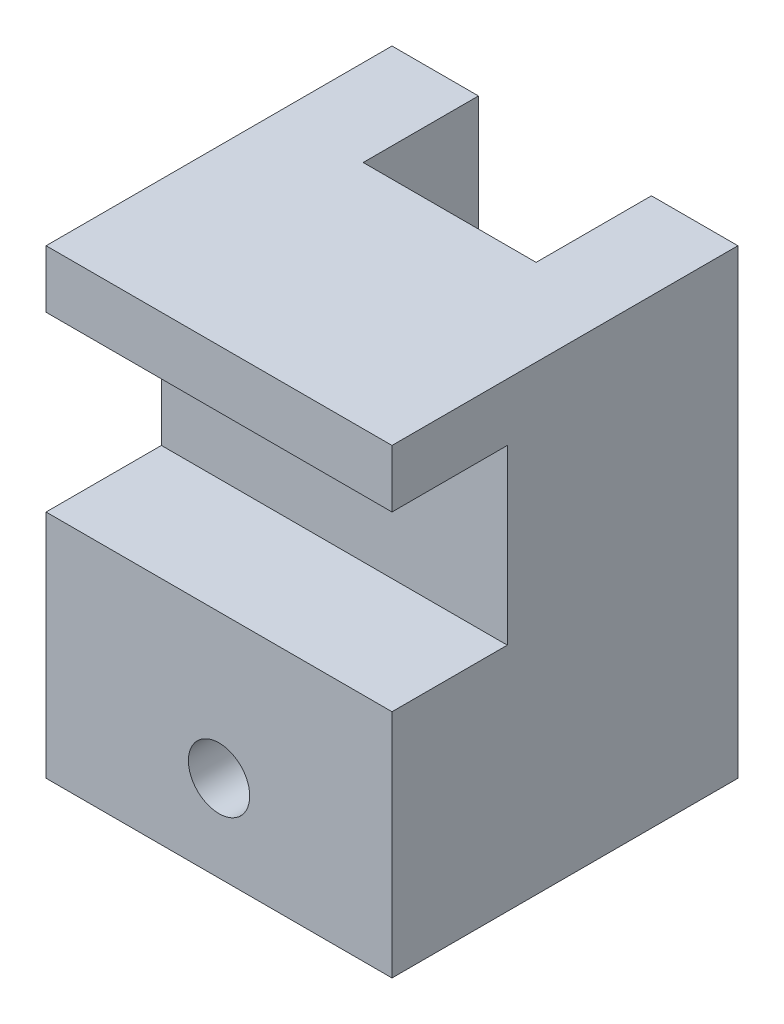
ISO-10303-21;
HEADER;
FILE_DESCRIPTION(('STEP AP214'),'2;1');
FILE_NAME('part.step','',(''),(''),'','','');
FILE_SCHEMA(('AUTOMOTIVE_DESIGN { 1 0 10303 214 1 1 1 1 }'));
ENDSEC;
DATA;
#1=APPLICATION_CONTEXT('core data for automotive mechanical design processes');
#2=APPLICATION_PROTOCOL_DEFINITION('international standard','automotive_design',2000,#1);
#3=PRODUCT_CONTEXT('',#1,'mechanical');
#4=PRODUCT('Part','Part','',(#3));
#5=PRODUCT_RELATED_PRODUCT_CATEGORY('part','',(#4));
#6=PRODUCT_DEFINITION_FORMATION('','',#4);
#7=PRODUCT_DEFINITION_CONTEXT('part definition',#1,'design');
#8=PRODUCT_DEFINITION('design','',#6,#7);
#9=PRODUCT_DEFINITION_SHAPE('','',#8);
#10=(LENGTH_UNIT() NAMED_UNIT(*) SI_UNIT(.MILLI.,.METRE.));
#11=(NAMED_UNIT(*) PLANE_ANGLE_UNIT() SI_UNIT($,.RADIAN.));
#12=(NAMED_UNIT(*) SI_UNIT($,.STERADIAN.) SOLID_ANGLE_UNIT());
#13=UNCERTAINTY_MEASURE_WITH_UNIT(LENGTH_MEASURE(1.E-05),#10,'distance_accuracy_value','');
#14=(GEOMETRIC_REPRESENTATION_CONTEXT(3) GLOBAL_UNCERTAINTY_ASSIGNED_CONTEXT((#13)) GLOBAL_UNIT_ASSIGNED_CONTEXT((#10,
#11,#12)) REPRESENTATION_CONTEXT('',''));
#15=CARTESIAN_POINT('',(0.,0.,0.));
#16=DIRECTION('',(0.,0.,1.));
#17=DIRECTION('',(1.,0.,0.));
#18=AXIS2_PLACEMENT_3D('',#15,#16,#17);
#19=CARTESIAN_POINT('',(0.,0.,19.05));
#20=DIRECTION('',(0.,0.,-1.));
#21=DIRECTION('',(-1.,0.,0.));
#22=AXIS2_PLACEMENT_3D('',#19,#20,#21);
#23=PLANE('',#22);
#24=CARTESIAN_POINT('',(0.,-15.875,19.05));
#25=DIRECTION('',(0.,0.,1.));
#26=DIRECTION('',(1.,0.,0.));
#27=AXIS2_PLACEMENT_3D('',#24,#25,#26);
#28=CIRCLE('',#27,3.37819999999999);
#29=CARTESIAN_POINT('',(3.37819999999999,-15.875,19.05));
#30=VERTEX_POINT('',#29);
#31=EDGE_CURVE('E142',#30,#30,#28,.T.);
#32=ORIENTED_EDGE('',*,*,#31,.F.);
#33=EDGE_LOOP('',(#32));
#34=FACE_BOUND('',#33,.T.);
#35=DIRECTION('',(0.,1.,0.));
#36=VECTOR('',#35,1.);
#37=CARTESIAN_POINT('',(19.05,-25.4,19.05));
#38=LINE('',#37,#36);
#39=CARTESIAN_POINT('',(19.05,-25.4,19.05));
#40=VERTEX_POINT('',#39);
#41=CARTESIAN_POINT('',(19.05,0.,19.05));
#42=VERTEX_POINT('',#41);
#43=EDGE_CURVE('E236',#40,#42,#38,.T.);
#44=ORIENTED_EDGE('',*,*,#43,.T.);
#45=DIRECTION('',(1.,0.,0.));
#46=VECTOR('',#45,1.);
#47=CARTESIAN_POINT('',(-19.05,0.,19.05));
#48=LINE('',#47,#46);
#49=CARTESIAN_POINT('',(-19.05,0.,19.05));
#50=VERTEX_POINT('',#49);
#51=EDGE_CURVE('E162',#50,#42,#48,.T.);
#52=ORIENTED_EDGE('',*,*,#51,.F.);
#53=DIRECTION('',(0.,1.,0.));
#54=VECTOR('',#53,1.);
#55=CARTESIAN_POINT('',(-19.05,-25.4,19.05));
#56=LINE('',#55,#54);
#57=CARTESIAN_POINT('',(-19.05,-25.4,19.05));
#58=VERTEX_POINT('',#57);
#59=EDGE_CURVE('E226',#58,#50,#56,.T.);
#60=ORIENTED_EDGE('',*,*,#59,.F.);
#61=DIRECTION('',(1.,0.,0.));
#62=VECTOR('',#61,1.);
#63=CARTESIAN_POINT('',(-19.05,-25.4,19.05));
#64=LINE('',#63,#62);
#65=EDGE_CURVE('E240',#58,#40,#64,.T.);
#66=ORIENTED_EDGE('',*,*,#65,.T.);
#67=EDGE_LOOP('',(#44,#52,#60,#66));
#68=FACE_BOUND('',#67,.T.);
#69=ADVANCED_FACE('F39',(#34,#68),#23,.F.);
#70=CARTESIAN_POINT('',(0.,0.,-19.05));
#71=DIRECTION('',(0.,0.,-1.));
#72=DIRECTION('',(-1.,0.,0.));
#73=AXIS2_PLACEMENT_3D('',#70,#71,#72);
#74=PLANE('',#73);
#75=DIRECTION('',(0.,1.,0.));
#76=VECTOR('',#75,1.);
#77=CARTESIAN_POINT('',(-9.525,-25.4,-19.05));
#78=LINE('',#77,#76);
#79=CARTESIAN_POINT('',(-9.525,-25.4,-19.05));
#80=VERTEX_POINT('',#79);
#81=CARTESIAN_POINT('',(-9.525,25.4,-19.05));
#82=VERTEX_POINT('',#81);
#83=EDGE_CURVE('E181',#80,#82,#78,.T.);
#84=ORIENTED_EDGE('',*,*,#83,.F.);
#85=DIRECTION('',(1.,0.,0.));
#86=VECTOR('',#85,1.);
#87=CARTESIAN_POINT('',(-19.05,-25.4,-19.05));
#88=LINE('',#87,#86);
#89=CARTESIAN_POINT('',(-19.05,-25.4,-19.05));
#90=VERTEX_POINT('',#89);
#91=EDGE_CURVE('E256',#90,#80,#88,.T.);
#92=ORIENTED_EDGE('',*,*,#91,.F.);
#93=DIRECTION('',(0.,1.,0.));
#94=VECTOR('',#93,1.);
#95=CARTESIAN_POINT('',(-19.05,-25.4,-19.05));
#96=LINE('',#95,#94);
#97=CARTESIAN_POINT('',(-19.05,25.4,-19.05));
#98=VERTEX_POINT('',#97);
#99=EDGE_CURVE('E216',#90,#98,#96,.T.);
#100=ORIENTED_EDGE('',*,*,#99,.T.);
#101=DIRECTION('',(1.,0.,0.));
#102=VECTOR('',#101,1.);
#103=CARTESIAN_POINT('',(-19.05,25.4,-19.05));
#104=LINE('',#103,#102);
#105=EDGE_CURVE('E247',#98,#82,#104,.T.);
#106=ORIENTED_EDGE('',*,*,#105,.T.);
#107=EDGE_LOOP('',(#84,#92,#100,#106));
#108=FACE_BOUND('',#107,.T.);
#109=ADVANCED_FACE('F281',(#108),#74,.T.);
#110=CARTESIAN_POINT('',(-19.05,-25.4,19.05));
#111=DIRECTION('',(-1.,0.,0.));
#112=DIRECTION('',(0.,0.,1.));
#113=AXIS2_PLACEMENT_3D('',#110,#111,#112);
#114=PLANE('',#113);
#115=DIRECTION('',(0.,0.,1.));
#116=VECTOR('',#115,1.);
#117=CARTESIAN_POINT('',(-19.05,0.,6.35));
#118=LINE('',#117,#116);
#119=CARTESIAN_POINT('',(-19.05,0.,6.35));
#120=VERTEX_POINT('',#119);
#121=EDGE_CURVE('E182',#120,#50,#118,.T.);
#122=ORIENTED_EDGE('',*,*,#121,.F.);
#123=DIRECTION('',(0.,-1.,0.));
#124=VECTOR('',#123,1.);
#125=CARTESIAN_POINT('',(-19.05,0.,6.35));
#126=LINE('',#125,#124);
#127=CARTESIAN_POINT('',(-19.05,19.05,6.35));
#128=VERTEX_POINT('',#127);
#129=EDGE_CURVE('E166',#128,#120,#126,.T.);
#130=ORIENTED_EDGE('',*,*,#129,.F.);
#131=DIRECTION('',(0.,0.,1.));
#132=VECTOR('',#131,1.);
#133=CARTESIAN_POINT('',(-19.05,19.05,6.35));
#134=LINE('',#133,#132);
#135=CARTESIAN_POINT('',(-19.05,19.05,19.05));
#136=VERTEX_POINT('',#135);
#137=EDGE_CURVE('E185',#128,#136,#134,.T.);
#138=ORIENTED_EDGE('',*,*,#137,.T.);
#139=CARTESIAN_POINT('',(-19.05,25.4,19.05));
#140=VERTEX_POINT('',#139);
#141=EDGE_CURVE('E231',#136,#140,#56,.T.);
#142=ORIENTED_EDGE('',*,*,#141,.T.);
#143=DIRECTION('',(0.,0.,-1.));
#144=VECTOR('',#143,1.);
#145=CARTESIAN_POINT('',(-19.05,25.4,19.05));
#146=LINE('',#145,#144);
#147=EDGE_CURVE('E43',#140,#98,#146,.T.);
#148=ORIENTED_EDGE('',*,*,#147,.T.);
#149=ORIENTED_EDGE('',*,*,#99,.F.);
#150=DIRECTION('',(0.,0.,-1.));
#151=VECTOR('',#150,1.);
#152=CARTESIAN_POINT('',(-19.05,-25.4,19.05));
#153=LINE('',#152,#151);
#154=EDGE_CURVE('E11',#58,#90,#153,.T.);
#155=ORIENTED_EDGE('',*,*,#154,.F.);
#156=ORIENTED_EDGE('',*,*,#59,.T.);
#157=EDGE_LOOP('',(#122,#130,#138,#142,#148,#149,#155,#156));
#158=FACE_BOUND('',#157,.T.);
#159=ADVANCED_FACE('F41',(#158),#114,.T.);
#160=CARTESIAN_POINT('',(-19.05,-25.4,19.05));
#161=DIRECTION('',(0.,1.,0.));
#162=DIRECTION('',(0.,0.,1.));
#163=AXIS2_PLACEMENT_3D('',#160,#161,#162);
#164=PLANE('',#163);
#165=ORIENTED_EDGE('',*,*,#91,.T.);
#166=DIRECTION('',(0.,0.,-1.));
#167=VECTOR('',#166,1.);
#168=CARTESIAN_POINT('',(-9.525,-25.4,-6.35));
#169=LINE('',#168,#167);
#170=CARTESIAN_POINT('',(-9.525,-25.4,-6.35));
#171=VERTEX_POINT('',#170);
#172=EDGE_CURVE('E213',#171,#80,#169,.T.);
#173=ORIENTED_EDGE('',*,*,#172,.F.);
#174=DIRECTION('',(-1.,0.,0.));
#175=VECTOR('',#174,1.);
#176=CARTESIAN_POINT('',(9.525,-25.4,-6.35));
#177=LINE('',#176,#175);
#178=CARTESIAN_POINT('',(9.525,-25.4,-6.35));
#179=VERTEX_POINT('',#178);
#180=EDGE_CURVE('E204',#179,#171,#177,.T.);
#181=ORIENTED_EDGE('',*,*,#180,.F.);
#182=DIRECTION('',(0.,0.,-1.));
#183=VECTOR('',#182,1.);
#184=CARTESIAN_POINT('',(9.525,-25.4,-6.35));
#185=LINE('',#184,#183);
#186=CARTESIAN_POINT('',(9.525,-25.4,-19.05));
#187=VERTEX_POINT('',#186);
#188=EDGE_CURVE('E217',#179,#187,#185,.T.);
#189=ORIENTED_EDGE('',*,*,#188,.T.);
#190=CARTESIAN_POINT('',(19.05,-25.4,-19.05));
#191=VERTEX_POINT('',#190);
#192=EDGE_CURVE('E255',#187,#191,#88,.T.);
#193=ORIENTED_EDGE('',*,*,#192,.T.);
#194=DIRECTION('',(0.,0.,-1.));
#195=VECTOR('',#194,1.);
#196=CARTESIAN_POINT('',(19.05,-25.4,19.05));
#197=LINE('',#196,#195);
#198=EDGE_CURVE('E49',#40,#191,#197,.T.);
#199=ORIENTED_EDGE('',*,*,#198,.F.);
#200=ORIENTED_EDGE('',*,*,#65,.F.);
#201=ORIENTED_EDGE('',*,*,#154,.T.);
#202=EDGE_LOOP('',(#165,#173,#181,#189,#193,#199,#200,#201));
#203=FACE_BOUND('',#202,.T.);
#204=ADVANCED_FACE('F284',(#203),#164,.F.);
#205=CARTESIAN_POINT('',(19.05,-25.4,19.05));
#206=DIRECTION('',(-1.,0.,0.));
#207=DIRECTION('',(0.,0.,1.));
#208=AXIS2_PLACEMENT_3D('',#205,#206,#207);
#209=PLANE('',#208);
#210=DIRECTION('',(0.,1.,0.));
#211=VECTOR('',#210,1.);
#212=CARTESIAN_POINT('',(19.05,0.,6.35));
#213=LINE('',#212,#211);
#214=CARTESIAN_POINT('',(19.05,0.,6.35));
#215=VERTEX_POINT('',#214);
#216=CARTESIAN_POINT('',(19.05,19.05,6.35));
#217=VERTEX_POINT('',#216);
#218=EDGE_CURVE('E157',#215,#217,#213,.T.);
#219=ORIENTED_EDGE('',*,*,#218,.F.);
#220=DIRECTION('',(0.,0.,1.));
#221=VECTOR('',#220,1.);
#222=CARTESIAN_POINT('',(19.05,0.,6.35));
#223=LINE('',#222,#221);
#224=EDGE_CURVE('E177',#215,#42,#223,.T.);
#225=ORIENTED_EDGE('',*,*,#224,.T.);
#226=ORIENTED_EDGE('',*,*,#43,.F.);
#227=ORIENTED_EDGE('',*,*,#198,.T.);
#228=DIRECTION('',(0.,1.,0.));
#229=VECTOR('',#228,1.);
#230=CARTESIAN_POINT('',(19.05,-25.4,-19.05));
#231=LINE('',#230,#229);
#232=CARTESIAN_POINT('',(19.05,25.4,-19.05));
#233=VERTEX_POINT('',#232);
#234=EDGE_CURVE('E251',#191,#233,#231,.T.);
#235=ORIENTED_EDGE('',*,*,#234,.T.);
#236=DIRECTION('',(0.,0.,-1.));
#237=VECTOR('',#236,1.);
#238=CARTESIAN_POINT('',(19.05,25.4,19.05));
#239=LINE('',#238,#237);
#240=CARTESIAN_POINT('',(19.05,25.4,19.05));
#241=VERTEX_POINT('',#240);
#242=EDGE_CURVE('E262',#241,#233,#239,.T.);
#243=ORIENTED_EDGE('',*,*,#242,.F.);
#244=CARTESIAN_POINT('',(19.05,19.05,19.05));
#245=VERTEX_POINT('',#244);
#246=EDGE_CURVE('E235',#245,#241,#38,.T.);
#247=ORIENTED_EDGE('',*,*,#246,.F.);
#248=DIRECTION('',(0.,0.,1.));
#249=VECTOR('',#248,1.);
#250=CARTESIAN_POINT('',(19.05,19.05,6.35));
#251=LINE('',#250,#249);
#252=EDGE_CURVE('E57',#217,#245,#251,.T.);
#253=ORIENTED_EDGE('',*,*,#252,.F.);
#254=EDGE_LOOP('',(#219,#225,#226,#227,#235,#243,#247,#253));
#255=FACE_BOUND('',#254,.T.);
#256=ADVANCED_FACE('F298',(#255),#209,.F.);
#257=CARTESIAN_POINT('',(-19.05,25.4,19.05));
#258=DIRECTION('',(0.,1.,0.));
#259=DIRECTION('',(0.,0.,1.));
#260=AXIS2_PLACEMENT_3D('',#257,#258,#259);
#261=PLANE('',#260);
#262=DIRECTION('',(0.,0.,-1.));
#263=VECTOR('',#262,1.);
#264=CARTESIAN_POINT('',(-9.525,25.4,-6.35));
#265=LINE('',#264,#263);
#266=CARTESIAN_POINT('',(-9.525,25.4,-6.35));
#267=VERTEX_POINT('',#266);
#268=EDGE_CURVE('E208',#267,#82,#265,.T.);
#269=ORIENTED_EDGE('',*,*,#268,.T.);
#270=ORIENTED_EDGE('',*,*,#105,.F.);
#271=ORIENTED_EDGE('',*,*,#147,.F.);
#272=DIRECTION('',(1.,0.,0.));
#273=VECTOR('',#272,1.);
#274=CARTESIAN_POINT('',(-19.05,25.4,19.05));
#275=LINE('',#274,#273);
#276=EDGE_CURVE('E230',#140,#241,#275,.T.);
#277=ORIENTED_EDGE('',*,*,#276,.T.);
#278=ORIENTED_EDGE('',*,*,#242,.T.);
#279=CARTESIAN_POINT('',(9.52499999999999,25.4,-19.05));
#280=VERTEX_POINT('',#279);
#281=EDGE_CURVE('E246',#280,#233,#104,.T.);
#282=ORIENTED_EDGE('',*,*,#281,.F.);
#283=DIRECTION('',(0.,0.,-1.));
#284=VECTOR('',#283,1.);
#285=CARTESIAN_POINT('',(9.525,25.4,-6.35));
#286=LINE('',#285,#284);
#287=CARTESIAN_POINT('',(9.525,25.4,-6.35));
#288=VERTEX_POINT('',#287);
#289=EDGE_CURVE('E65',#288,#280,#286,.T.);
#290=ORIENTED_EDGE('',*,*,#289,.F.);
#291=DIRECTION('',(1.,0.,0.));
#292=VECTOR('',#291,1.);
#293=CARTESIAN_POINT('',(9.525,25.4,-6.35));
#294=LINE('',#293,#292);
#295=EDGE_CURVE('E195',#267,#288,#294,.T.);
#296=ORIENTED_EDGE('',*,*,#295,.F.);
#297=EDGE_LOOP('',(#269,#270,#271,#277,#278,#282,#290,#296));
#298=FACE_BOUND('',#297,.T.);
#299=ADVANCED_FACE('F276',(#298),#261,.T.);
#300=ORIENTED_EDGE('',*,*,#141,.F.);
#301=DIRECTION('',(-1.,0.,0.));
#302=VECTOR('',#301,1.);
#303=CARTESIAN_POINT('',(-19.05,19.05,19.05));
#304=LINE('',#303,#302);
#305=EDGE_CURVE('E156',#245,#136,#304,.T.);
#306=ORIENTED_EDGE('',*,*,#305,.F.);
#307=ORIENTED_EDGE('',*,*,#246,.T.);
#308=ORIENTED_EDGE('',*,*,#276,.F.);
#309=EDGE_LOOP('',(#300,#306,#307,#308));
#310=FACE_BOUND('',#309,.T.);
#311=ADVANCED_FACE('F303',(#310),#23,.F.);
#312=DIRECTION('',(0.,-1.,0.));
#313=VECTOR('',#312,1.);
#314=CARTESIAN_POINT('',(9.525,-25.4,-19.05));
#315=LINE('',#314,#313);
#316=EDGE_CURVE('E196',#280,#187,#315,.T.);
#317=ORIENTED_EDGE('',*,*,#316,.F.);
#318=ORIENTED_EDGE('',*,*,#281,.T.);
#319=ORIENTED_EDGE('',*,*,#234,.F.);
#320=ORIENTED_EDGE('',*,*,#192,.F.);
#321=EDGE_LOOP('',(#317,#318,#319,#320));
#322=FACE_BOUND('',#321,.T.);
#323=ADVANCED_FACE('F309',(#322),#74,.T.);
#324=CARTESIAN_POINT('',(-9.525,-25.4,-6.35));
#325=DIRECTION('',(-1.,0.,0.));
#326=DIRECTION('',(0.,0.,1.));
#327=AXIS2_PLACEMENT_3D('',#324,#325,#326);
#328=PLANE('',#327);
#329=ORIENTED_EDGE('',*,*,#83,.T.);
#330=ORIENTED_EDGE('',*,*,#268,.F.);
#331=DIRECTION('',(0.,1.,0.));
#332=VECTOR('',#331,1.);
#333=CARTESIAN_POINT('',(-9.525,-25.4,-6.35));
#334=LINE('',#333,#332);
#335=EDGE_CURVE('E191',#171,#267,#334,.T.);
#336=ORIENTED_EDGE('',*,*,#335,.F.);
#337=ORIENTED_EDGE('',*,*,#172,.T.);
#338=EDGE_LOOP('',(#329,#330,#336,#337));
#339=FACE_BOUND('',#338,.T.);
#340=ADVANCED_FACE('F314',(#339),#328,.F.);
#341=CARTESIAN_POINT('',(9.525,-25.4,-6.35));
#342=DIRECTION('',(1.,0.,0.));
#343=DIRECTION('',(0.,0.,-1.));
#344=AXIS2_PLACEMENT_3D('',#341,#342,#343);
#345=PLANE('',#344);
#346=ORIENTED_EDGE('',*,*,#316,.T.);
#347=ORIENTED_EDGE('',*,*,#188,.F.);
#348=DIRECTION('',(0.,-1.,0.));
#349=VECTOR('',#348,1.);
#350=CARTESIAN_POINT('',(9.525,-25.4,-6.35));
#351=LINE('',#350,#349);
#352=EDGE_CURVE('E200',#288,#179,#351,.T.);
#353=ORIENTED_EDGE('',*,*,#352,.F.);
#354=ORIENTED_EDGE('',*,*,#289,.T.);
#355=EDGE_LOOP('',(#346,#347,#353,#354));
#356=FACE_BOUND('',#355,.T.);
#357=ADVANCED_FACE('F316',(#356),#345,.F.);
#358=CARTESIAN_POINT('',(0.,0.,-6.35));
#359=DIRECTION('',(0.,0.,1.));
#360=DIRECTION('',(1.,0.,0.));
#361=AXIS2_PLACEMENT_3D('',#358,#359,#360);
#362=PLANE('',#361);
#363=CARTESIAN_POINT('',(0.,-15.875,-6.35));
#364=DIRECTION('',(0.,0.,1.));
#365=DIRECTION('',(1.,0.,0.));
#366=AXIS2_PLACEMENT_3D('',#363,#364,#365);
#367=CIRCLE('',#366,3.37819999999999);
#368=CARTESIAN_POINT('',(3.37819999999999,-15.875,-6.35));
#369=VERTEX_POINT('',#368);
#370=EDGE_CURVE('E148',#369,#369,#367,.T.);
#371=ORIENTED_EDGE('',*,*,#370,.T.);
#372=EDGE_LOOP('',(#371));
#373=FACE_BOUND('',#372,.T.);
#374=ORIENTED_EDGE('',*,*,#335,.T.);
#375=ORIENTED_EDGE('',*,*,#295,.T.);
#376=ORIENTED_EDGE('',*,*,#352,.T.);
#377=ORIENTED_EDGE('',*,*,#180,.T.);
#378=EDGE_LOOP('',(#374,#375,#376,#377));
#379=FACE_BOUND('',#378,.T.);
#380=ADVANCED_FACE('F312',(#373,#379),#362,.F.);
#381=CARTESIAN_POINT('',(-19.05,0.,6.35));
#382=DIRECTION('',(0.,-1.,0.));
#383=DIRECTION('',(0.,0.,-1.));
#384=AXIS2_PLACEMENT_3D('',#381,#382,#383);
#385=PLANE('',#384);
#386=ORIENTED_EDGE('',*,*,#51,.T.);
#387=ORIENTED_EDGE('',*,*,#224,.F.);
#388=DIRECTION('',(1.,0.,0.));
#389=VECTOR('',#388,1.);
#390=CARTESIAN_POINT('',(-19.05,0.,6.35));
#391=LINE('',#390,#389);
#392=EDGE_CURVE('E169',#120,#215,#391,.T.);
#393=ORIENTED_EDGE('',*,*,#392,.F.);
#394=ORIENTED_EDGE('',*,*,#121,.T.);
#395=EDGE_LOOP('',(#386,#387,#393,#394));
#396=FACE_BOUND('',#395,.T.);
#397=ADVANCED_FACE('F294',(#396),#385,.F.);
#398=CARTESIAN_POINT('',(-19.05,19.05,6.35));
#399=DIRECTION('',(0.,1.,0.));
#400=DIRECTION('',(0.,0.,1.));
#401=AXIS2_PLACEMENT_3D('',#398,#399,#400);
#402=PLANE('',#401);
#403=ORIENTED_EDGE('',*,*,#305,.T.);
#404=ORIENTED_EDGE('',*,*,#137,.F.);
#405=DIRECTION('',(-1.,0.,0.));
#406=VECTOR('',#405,1.);
#407=CARTESIAN_POINT('',(-19.05,19.05,6.35));
#408=LINE('',#407,#406);
#409=EDGE_CURVE('E161',#217,#128,#408,.T.);
#410=ORIENTED_EDGE('',*,*,#409,.F.);
#411=ORIENTED_EDGE('',*,*,#252,.T.);
#412=EDGE_LOOP('',(#403,#404,#410,#411));
#413=FACE_BOUND('',#412,.T.);
#414=ADVANCED_FACE('F393',(#413),#402,.F.);
#415=CARTESIAN_POINT('',(0.,0.,6.35));
#416=DIRECTION('',(0.,0.,-1.));
#417=DIRECTION('',(-1.,0.,0.));
#418=AXIS2_PLACEMENT_3D('',#415,#416,#417);
#419=PLANE('',#418);
#420=CARTESIAN_POINT('',(0.,9.525,6.35));
#421=DIRECTION('',(0.,0.,1.));
#422=DIRECTION('',(1.,0.,0.));
#423=AXIS2_PLACEMENT_3D('',#420,#421,#422);
#424=CIRCLE('',#423,1.72719999999999);
#425=CARTESIAN_POINT('',(1.72719999999999,9.525,6.35));
#426=VERTEX_POINT('',#425);
#427=EDGE_CURVE('E143',#426,#426,#424,.T.);
#428=ORIENTED_EDGE('',*,*,#427,.F.);
#429=EDGE_LOOP('',(#428));
#430=FACE_BOUND('',#429,.T.);
#431=ORIENTED_EDGE('',*,*,#218,.T.);
#432=ORIENTED_EDGE('',*,*,#409,.T.);
#433=ORIENTED_EDGE('',*,*,#129,.T.);
#434=ORIENTED_EDGE('',*,*,#392,.T.);
#435=EDGE_LOOP('',(#431,#432,#433,#434));
#436=FACE_BOUND('',#435,.T.);
#437=ADVANCED_FACE('F301',(#430,#436),#419,.F.);
#438=CARTESIAN_POINT('',(0.,-15.875,19.05));
#439=DIRECTION('',(0.,0.,1.));
#440=DIRECTION('',(1.,0.,0.));
#441=AXIS2_PLACEMENT_3D('',#438,#439,#440);
#442=CYLINDRICAL_SURFACE('',#441,3.37819999999999);
#443=ORIENTED_EDGE('',*,*,#31,.T.);
#444=EDGE_LOOP('',(#443));
#445=FACE_BOUND('',#444,.T.);
#446=ORIENTED_EDGE('',*,*,#370,.F.);
#447=EDGE_LOOP('',(#446));
#448=FACE_BOUND('',#447,.T.);
#449=ADVANCED_FACE('F135',(#445,#448),#442,.F.);
#450=CARTESIAN_POINT('',(0.,9.525,-4.318));
#451=DIRECTION('',(0.,0.,1.));
#452=DIRECTION('',(1.,0.,0.));
#453=AXIS2_PLACEMENT_3D('',#450,#451,#452);
#454=CONICAL_SURFACE('',#453,1.72719999999999,1.02974425867665);
#455=CARTESIAN_POINT('',(0.,9.525,-5.35580646118439));
#456=VERTEX_POINT('',#455);
#457=VERTEX_LOOP('',#456);
#458=FACE_BOUND('',#457,.T.);
#459=CARTESIAN_POINT('',(0.,9.525,-4.318));
#460=DIRECTION('',(0.,0.,1.));
#461=DIRECTION('',(1.,0.,0.));
#462=AXIS2_PLACEMENT_3D('',#459,#460,#461);
#463=CIRCLE('',#462,1.72719999999999);
#464=CARTESIAN_POINT('',(1.72719999999999,9.525,-4.318));
#465=VERTEX_POINT('',#464);
#466=EDGE_CURVE('E139',#465,#465,#463,.T.);
#467=ORIENTED_EDGE('',*,*,#466,.T.);
#468=EDGE_LOOP('',(#467));
#469=FACE_BOUND('',#468,.T.);
#470=ADVANCED_FACE('F131',(#458,#469),#454,.F.);
#471=CARTESIAN_POINT('',(0.,9.525,6.35));
#472=DIRECTION('',(0.,0.,1.));
#473=DIRECTION('',(1.,0.,0.));
#474=AXIS2_PLACEMENT_3D('',#471,#472,#473);
#475=CYLINDRICAL_SURFACE('',#474,1.72719999999999);
#476=ORIENTED_EDGE('',*,*,#466,.F.);
#477=EDGE_LOOP('',(#476));
#478=FACE_BOUND('',#477,.T.);
#479=ORIENTED_EDGE('',*,*,#427,.T.);
#480=EDGE_LOOP('',(#479));
#481=FACE_BOUND('',#480,.T.);
#482=ADVANCED_FACE('F134',(#478,#481),#475,.F.);
#483=CLOSED_SHELL('',(#69,#109,#159,#204,#256,#299,#311,#323,#340,#357,#380,#397,#414,#437,#449,
#470,#482));
#484=MANIFOLD_SOLID_BREP('B2',#483);
#485=ADVANCED_BREP_SHAPE_REPRESENTATION('',(#18,#484),#14);
#486=SHAPE_DEFINITION_REPRESENTATION(#9,#485);
ENDSEC;
END-ISO-10303-21;
